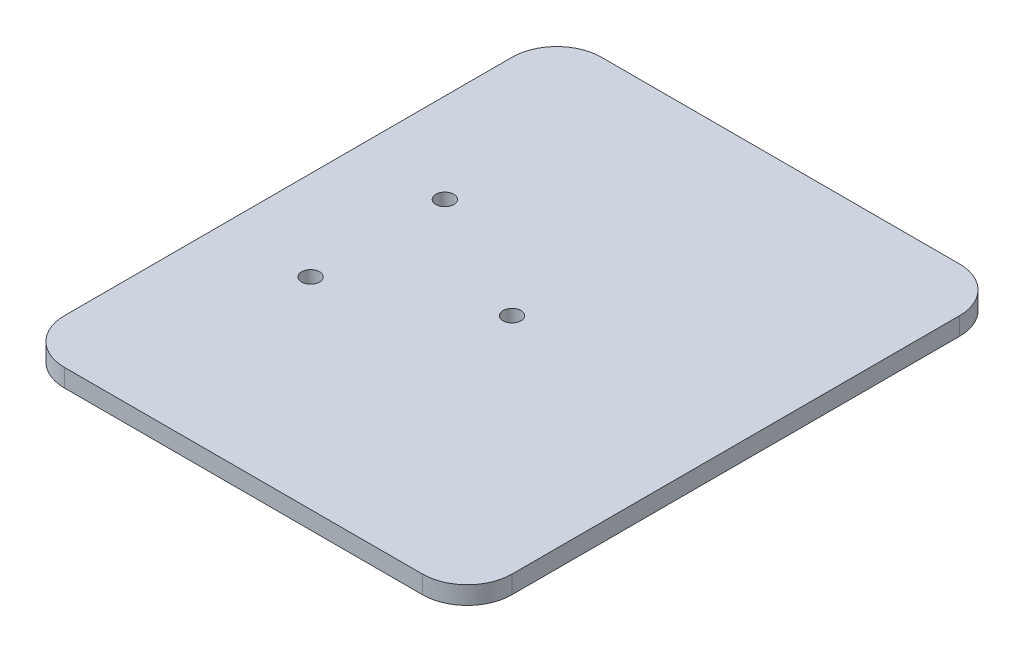
ISO-10303-21;
HEADER;
FILE_DESCRIPTION(('STEP AP214'),'2;1');
FILE_NAME('part.step','',(''),(''),'','','');
FILE_SCHEMA(('AUTOMOTIVE_DESIGN { 1 0 10303 214 1 1 1 1 }'));
ENDSEC;
DATA;
#1=APPLICATION_CONTEXT('core data for automotive mechanical design processes');
#2=APPLICATION_PROTOCOL_DEFINITION('international standard','automotive_design',2000,#1);
#3=PRODUCT_CONTEXT('',#1,'mechanical');
#4=PRODUCT('Part','Part','',(#3));
#5=PRODUCT_RELATED_PRODUCT_CATEGORY('part','',(#4));
#6=PRODUCT_DEFINITION_FORMATION('','',#4);
#7=PRODUCT_DEFINITION_CONTEXT('part definition',#1,'design');
#8=PRODUCT_DEFINITION('design','',#6,#7);
#9=PRODUCT_DEFINITION_SHAPE('','',#8);
#10=(LENGTH_UNIT() NAMED_UNIT(*) SI_UNIT(.MILLI.,.METRE.));
#11=(NAMED_UNIT(*) PLANE_ANGLE_UNIT() SI_UNIT($,.RADIAN.));
#12=(NAMED_UNIT(*) SI_UNIT($,.STERADIAN.) SOLID_ANGLE_UNIT());
#13=UNCERTAINTY_MEASURE_WITH_UNIT(LENGTH_MEASURE(1.E-05),#10,'distance_accuracy_value','');
#14=(GEOMETRIC_REPRESENTATION_CONTEXT(3) GLOBAL_UNCERTAINTY_ASSIGNED_CONTEXT((#13)) GLOBAL_UNIT_ASSIGNED_CONTEXT((#10,
#11,#12)) REPRESENTATION_CONTEXT('',''));
#15=CARTESIAN_POINT('',(0.,0.,0.));
#16=DIRECTION('',(0.,0.,1.));
#17=DIRECTION('',(1.,0.,0.));
#18=AXIS2_PLACEMENT_3D('',#15,#16,#17);
#19=CARTESIAN_POINT('',(-52.2549019607844,2.,28.7254901960784));
#20=DIRECTION('',(0.,1.,0.));
#21=DIRECTION('',(0.,0.,1.));
#22=AXIS2_PLACEMENT_3D('',#19,#20,#21);
#23=PLANE('',#22);
#24=CARTESIAN_POINT('',(-47.2549019607844,2.,-3.77450980392158));
#25=DIRECTION('',(0.,1.,0.));
#26=DIRECTION('',(0.,0.,1.));
#27=AXIS2_PLACEMENT_3D('',#24,#25,#26);
#28=CIRCLE('',#27,0.999999999999998);
#29=CARTESIAN_POINT('',(-47.2549019607844,2.,-2.77450980392158));
#30=VERTEX_POINT('',#29);
#31=EDGE_CURVE('E217',#30,#30,#28,.T.);
#32=ORIENTED_EDGE('',*,*,#31,.F.);
#33=EDGE_LOOP('',(#32));
#34=FACE_BOUND('',#33,.T.);
#35=CARTESIAN_POINT('',(-52.2549019607844,2.,28.7254901960784));
#36=DIRECTION('',(0.,1.,0.));
#37=DIRECTION('',(0.,0.,1.));
#38=AXIS2_PLACEMENT_3D('',#35,#36,#37);
#39=CIRCLE('',#38,5.);
#40=CARTESIAN_POINT('',(-57.2549019607844,2.,28.7254901960784));
#41=VERTEX_POINT('',#40);
#42=CARTESIAN_POINT('',(-52.2549019607843,2.,33.7254901960784));
#43=VERTEX_POINT('',#42);
#44=EDGE_CURVE('E168',#41,#43,#39,.T.);
#45=ORIENTED_EDGE('',*,*,#44,.T.);
#46=DIRECTION('',(1.,0.,0.));
#47=VECTOR('',#46,1.);
#48=CARTESIAN_POINT('',(-52.2549019607843,2.,33.7254901960784));
#49=LINE('',#48,#47);
#50=CARTESIAN_POINT('',(-12.2549019607844,2.,33.7254901960784));
#51=VERTEX_POINT('',#50);
#52=EDGE_CURVE('E104',#43,#51,#49,.T.);
#53=ORIENTED_EDGE('',*,*,#52,.T.);
#54=CARTESIAN_POINT('',(-12.2549019607843,2.,28.7254901960784));
#55=DIRECTION('',(0.,1.,0.));
#56=DIRECTION('',(0.,0.,1.));
#57=AXIS2_PLACEMENT_3D('',#54,#55,#56);
#58=CIRCLE('',#57,5.);
#59=CARTESIAN_POINT('',(-7.25490196078435,2.,28.7254901960784));
#60=VERTEX_POINT('',#59);
#61=EDGE_CURVE('E189',#51,#60,#58,.T.);
#62=ORIENTED_EDGE('',*,*,#61,.T.);
#63=DIRECTION('',(0.,0.,-1.));
#64=VECTOR('',#63,1.);
#65=CARTESIAN_POINT('',(-7.25490196078435,2.,-21.2745098039215));
#66=LINE('',#65,#64);
#67=CARTESIAN_POINT('',(-7.25490196078435,2.,-21.2745098039215));
#68=VERTEX_POINT('',#67);
#69=EDGE_CURVE('E203',#60,#68,#66,.T.);
#70=ORIENTED_EDGE('',*,*,#69,.T.);
#71=CARTESIAN_POINT('',(-12.2549019607843,2.,-21.2745098039216));
#72=DIRECTION('',(0.,1.,0.));
#73=DIRECTION('',(0.,0.,-1.));
#74=AXIS2_PLACEMENT_3D('',#71,#72,#73);
#75=CIRCLE('',#74,5.);
#76=CARTESIAN_POINT('',(-12.2549019607844,2.,-26.2745098039216));
#77=VERTEX_POINT('',#76);
#78=EDGE_CURVE('E123',#68,#77,#75,.T.);
#79=ORIENTED_EDGE('',*,*,#78,.T.);
#80=DIRECTION('',(-1.,0.,0.));
#81=VECTOR('',#80,1.);
#82=CARTESIAN_POINT('',(-52.2549019607843,2.,-26.2745098039216));
#83=LINE('',#82,#81);
#84=CARTESIAN_POINT('',(-52.2549019607843,2.,-26.2745098039216));
#85=VERTEX_POINT('',#84);
#86=EDGE_CURVE('E117',#77,#85,#83,.T.);
#87=ORIENTED_EDGE('',*,*,#86,.T.);
#88=CARTESIAN_POINT('',(-52.2549019607844,2.,-21.2745098039216));
#89=DIRECTION('',(0.,1.,0.));
#90=DIRECTION('',(0.,0.,1.));
#91=AXIS2_PLACEMENT_3D('',#88,#89,#90);
#92=CIRCLE('',#91,5.);
#93=CARTESIAN_POINT('',(-57.2549019607844,2.,-21.2745098039215));
#94=VERTEX_POINT('',#93);
#95=EDGE_CURVE('E121',#85,#94,#92,.T.);
#96=ORIENTED_EDGE('',*,*,#95,.T.);
#97=DIRECTION('',(0.,0.,1.));
#98=VECTOR('',#97,1.);
#99=CARTESIAN_POINT('',(-57.2549019607844,2.,-21.2745098039215));
#100=LINE('',#99,#98);
#101=EDGE_CURVE('E61',#94,#41,#100,.T.);
#102=ORIENTED_EDGE('',*,*,#101,.T.);
#103=EDGE_LOOP('',(#45,#53,#62,#70,#79,#87,#96,#102));
#104=FACE_BOUND('',#103,.T.);
#105=CARTESIAN_POINT('',(-32.2549019607844,2.,3.72549019607842));
#106=DIRECTION('',(0.,1.,0.));
#107=DIRECTION('',(0.,0.,1.));
#108=AXIS2_PLACEMENT_3D('',#105,#106,#107);
#109=CIRCLE('',#108,0.999999999999998);
#110=CARTESIAN_POINT('',(-32.2549019607844,2.,4.72549019607842));
#111=VERTEX_POINT('',#110);
#112=EDGE_CURVE('E150',#111,#111,#109,.T.);
#113=ORIENTED_EDGE('',*,*,#112,.F.);
#114=EDGE_LOOP('',(#113));
#115=FACE_BOUND('',#114,.T.);
#116=CARTESIAN_POINT('',(-47.2549019607844,2.,11.2254901960784));
#117=DIRECTION('',(0.,1.,0.));
#118=DIRECTION('',(0.,0.,1.));
#119=AXIS2_PLACEMENT_3D('',#116,#117,#118);
#120=CIRCLE('',#119,0.999999999999998);
#121=CARTESIAN_POINT('',(-47.2549019607844,2.,12.2254901960784));
#122=VERTEX_POINT('',#121);
#123=EDGE_CURVE('E225',#122,#122,#120,.T.);
#124=ORIENTED_EDGE('',*,*,#123,.F.);
#125=EDGE_LOOP('',(#124));
#126=FACE_BOUND('',#125,.T.);
#127=ADVANCED_FACE('F43',(#34,#104,#115,#126),#23,.T.);
#128=CARTESIAN_POINT('',(-52.2549019607844,0.,28.7254901960784));
#129=DIRECTION('',(0.,1.,0.));
#130=DIRECTION('',(0.,0.,1.));
#131=AXIS2_PLACEMENT_3D('',#128,#129,#130);
#132=PLANE('',#131);
#133=CARTESIAN_POINT('',(-52.2549019607844,0.,28.7254901960784));
#134=DIRECTION('',(0.,1.,0.));
#135=DIRECTION('',(0.,0.,1.));
#136=AXIS2_PLACEMENT_3D('',#133,#134,#135);
#137=CIRCLE('',#136,5.);
#138=CARTESIAN_POINT('',(-57.2549019607844,0.,28.7254901960784));
#139=VERTEX_POINT('',#138);
#140=CARTESIAN_POINT('',(-52.2549019607843,0.,33.7254901960784));
#141=VERTEX_POINT('',#140);
#142=EDGE_CURVE('E145',#139,#141,#137,.T.);
#143=ORIENTED_EDGE('',*,*,#142,.F.);
#144=DIRECTION('',(0.,0.,1.));
#145=VECTOR('',#144,1.);
#146=CARTESIAN_POINT('',(-57.2549019607844,0.,-21.2745098039215));
#147=LINE('',#146,#145);
#148=CARTESIAN_POINT('',(-57.2549019607844,0.,-21.2745098039215));
#149=VERTEX_POINT('',#148);
#150=EDGE_CURVE('E96',#149,#139,#147,.T.);
#151=ORIENTED_EDGE('',*,*,#150,.F.);
#152=CARTESIAN_POINT('',(-52.2549019607844,0.,-21.2745098039216));
#153=DIRECTION('',(0.,1.,0.));
#154=DIRECTION('',(0.,0.,1.));
#155=AXIS2_PLACEMENT_3D('',#152,#153,#154);
#156=CIRCLE('',#155,5.);
#157=CARTESIAN_POINT('',(-52.2549019607843,0.,-26.2745098039216));
#158=VERTEX_POINT('',#157);
#159=EDGE_CURVE('E90',#158,#149,#156,.T.);
#160=ORIENTED_EDGE('',*,*,#159,.F.);
#161=DIRECTION('',(-1.,0.,0.));
#162=VECTOR('',#161,1.);
#163=CARTESIAN_POINT('',(-52.2549019607843,0.,-26.2745098039216));
#164=LINE('',#163,#162);
#165=CARTESIAN_POINT('',(-12.2549019607844,0.,-26.2745098039216));
#166=VERTEX_POINT('',#165);
#167=EDGE_CURVE('E132',#166,#158,#164,.T.);
#168=ORIENTED_EDGE('',*,*,#167,.F.);
#169=CARTESIAN_POINT('',(-12.2549019607843,0.,-21.2745098039216));
#170=DIRECTION('',(0.,1.,0.));
#171=DIRECTION('',(0.,0.,-1.));
#172=AXIS2_PLACEMENT_3D('',#169,#170,#171);
#173=CIRCLE('',#172,5.);
#174=CARTESIAN_POINT('',(-7.25490196078435,0.,-21.2745098039215));
#175=VERTEX_POINT('',#174);
#176=EDGE_CURVE('E159',#175,#166,#173,.T.);
#177=ORIENTED_EDGE('',*,*,#176,.F.);
#178=DIRECTION('',(0.,0.,-1.));
#179=VECTOR('',#178,1.);
#180=CARTESIAN_POINT('',(-7.25490196078435,0.,-21.2745098039215));
#181=LINE('',#180,#179);
#182=CARTESIAN_POINT('',(-7.25490196078435,0.,28.7254901960784));
#183=VERTEX_POINT('',#182);
#184=EDGE_CURVE('E156',#183,#175,#181,.T.);
#185=ORIENTED_EDGE('',*,*,#184,.F.);
#186=CARTESIAN_POINT('',(-12.2549019607843,0.,28.7254901960784));
#187=DIRECTION('',(0.,1.,0.));
#188=DIRECTION('',(0.,0.,1.));
#189=AXIS2_PLACEMENT_3D('',#186,#187,#188);
#190=CIRCLE('',#189,5.);
#191=CARTESIAN_POINT('',(-12.2549019607844,0.,33.7254901960784));
#192=VERTEX_POINT('',#191);
#193=EDGE_CURVE('E153',#192,#183,#190,.T.);
#194=ORIENTED_EDGE('',*,*,#193,.F.);
#195=DIRECTION('',(1.,0.,0.));
#196=VECTOR('',#195,1.);
#197=CARTESIAN_POINT('',(-52.2549019607843,0.,33.7254901960784));
#198=LINE('',#197,#196);
#199=EDGE_CURVE('E149',#141,#192,#198,.T.);
#200=ORIENTED_EDGE('',*,*,#199,.F.);
#201=EDGE_LOOP('',(#143,#151,#160,#168,#177,#185,#194,#200));
#202=FACE_BOUND('',#201,.T.);
#203=CARTESIAN_POINT('',(-32.2549019607844,0.,3.72549019607842));
#204=DIRECTION('',(0.,1.,0.));
#205=DIRECTION('',(0.,0.,1.));
#206=AXIS2_PLACEMENT_3D('',#203,#204,#205);
#207=CIRCLE('',#206,0.999999999999998);
#208=CARTESIAN_POINT('',(-32.2549019607844,0.,4.72549019607842));
#209=VERTEX_POINT('',#208);
#210=EDGE_CURVE('E213',#209,#209,#207,.T.);
#211=ORIENTED_EDGE('',*,*,#210,.T.);
#212=EDGE_LOOP('',(#211));
#213=FACE_BOUND('',#212,.T.);
#214=CARTESIAN_POINT('',(-47.2549019607844,0.,-3.77450980392158));
#215=DIRECTION('',(0.,1.,0.));
#216=DIRECTION('',(0.,0.,1.));
#217=AXIS2_PLACEMENT_3D('',#214,#215,#216);
#218=CIRCLE('',#217,0.999999999999998);
#219=CARTESIAN_POINT('',(-47.2549019607844,0.,-2.77450980392158));
#220=VERTEX_POINT('',#219);
#221=EDGE_CURVE('E221',#220,#220,#218,.T.);
#222=ORIENTED_EDGE('',*,*,#221,.T.);
#223=EDGE_LOOP('',(#222));
#224=FACE_BOUND('',#223,.T.);
#225=CARTESIAN_POINT('',(-47.2549019607844,0.,11.2254901960784));
#226=DIRECTION('',(0.,1.,0.));
#227=DIRECTION('',(0.,0.,1.));
#228=AXIS2_PLACEMENT_3D('',#225,#226,#227);
#229=CIRCLE('',#228,0.999999999999998);
#230=CARTESIAN_POINT('',(-47.2549019607844,0.,12.2254901960784));
#231=VERTEX_POINT('',#230);
#232=EDGE_CURVE('E229',#231,#231,#229,.T.);
#233=ORIENTED_EDGE('',*,*,#232,.T.);
#234=EDGE_LOOP('',(#233));
#235=FACE_BOUND('',#234,.T.);
#236=ADVANCED_FACE('F193',(#202,#213,#224,#235),#132,.F.);
#237=CARTESIAN_POINT('',(-52.2549019607844,2.,28.7254901960784));
#238=DIRECTION('',(0.,-1.,0.));
#239=DIRECTION('',(0.,0.,-1.));
#240=AXIS2_PLACEMENT_3D('',#237,#238,#239);
#241=CYLINDRICAL_SURFACE('',#240,5.);
#242=ORIENTED_EDGE('',*,*,#142,.T.);
#243=DIRECTION('',(0.,-1.,0.));
#244=VECTOR('',#243,1.);
#245=CARTESIAN_POINT('',(-52.2549019607843,2.,33.7254901960784));
#246=LINE('',#245,#244);
#247=EDGE_CURVE('E11',#43,#141,#246,.T.);
#248=ORIENTED_EDGE('',*,*,#247,.F.);
#249=ORIENTED_EDGE('',*,*,#44,.F.);
#250=DIRECTION('',(0.,-1.,0.));
#251=VECTOR('',#250,1.);
#252=CARTESIAN_POINT('',(-57.2549019607844,2.,28.7254901960784));
#253=LINE('',#252,#251);
#254=EDGE_CURVE('E141',#41,#139,#253,.T.);
#255=ORIENTED_EDGE('',*,*,#254,.T.);
#256=EDGE_LOOP('',(#242,#248,#249,#255));
#257=FACE_BOUND('',#256,.T.);
#258=ADVANCED_FACE('F45',(#257),#241,.T.);
#259=CARTESIAN_POINT('',(-52.2549019607843,2.,33.7254901960784));
#260=DIRECTION('',(0.,0.,-1.));
#261=DIRECTION('',(-1.,0.,0.));
#262=AXIS2_PLACEMENT_3D('',#259,#260,#261);
#263=PLANE('',#262);
#264=ORIENTED_EDGE('',*,*,#199,.T.);
#265=DIRECTION('',(0.,-1.,0.));
#266=VECTOR('',#265,1.);
#267=CARTESIAN_POINT('',(-12.2549019607844,2.,33.7254901960784));
#268=LINE('',#267,#266);
#269=EDGE_CURVE('E53',#51,#192,#268,.T.);
#270=ORIENTED_EDGE('',*,*,#269,.F.);
#271=ORIENTED_EDGE('',*,*,#52,.F.);
#272=ORIENTED_EDGE('',*,*,#247,.T.);
#273=EDGE_LOOP('',(#264,#270,#271,#272));
#274=FACE_BOUND('',#273,.T.);
#275=ADVANCED_FACE('F264',(#274),#263,.F.);
#276=CARTESIAN_POINT('',(-12.2549019607843,2.,28.7254901960784));
#277=DIRECTION('',(0.,-1.,0.));
#278=DIRECTION('',(0.,0.,-1.));
#279=AXIS2_PLACEMENT_3D('',#276,#277,#278);
#280=CYLINDRICAL_SURFACE('',#279,5.);
#281=ORIENTED_EDGE('',*,*,#193,.T.);
#282=DIRECTION('',(0.,-1.,0.));
#283=VECTOR('',#282,1.);
#284=CARTESIAN_POINT('',(-7.25490196078435,2.,28.7254901960784));
#285=LINE('',#284,#283);
#286=EDGE_CURVE('E179',#60,#183,#285,.T.);
#287=ORIENTED_EDGE('',*,*,#286,.F.);
#288=ORIENTED_EDGE('',*,*,#61,.F.);
#289=ORIENTED_EDGE('',*,*,#269,.T.);
#290=EDGE_LOOP('',(#281,#287,#288,#289));
#291=FACE_BOUND('',#290,.T.);
#292=ADVANCED_FACE('F187',(#291),#280,.T.);
#293=CARTESIAN_POINT('',(-7.25490196078435,2.,-21.2745098039215));
#294=DIRECTION('',(-1.,0.,0.));
#295=DIRECTION('',(0.,0.,1.));
#296=AXIS2_PLACEMENT_3D('',#293,#294,#295);
#297=PLANE('',#296);
#298=ORIENTED_EDGE('',*,*,#184,.T.);
#299=DIRECTION('',(0.,-1.,0.));
#300=VECTOR('',#299,1.);
#301=CARTESIAN_POINT('',(-7.25490196078435,2.,-21.2745098039215));
#302=LINE('',#301,#300);
#303=EDGE_CURVE('E175',#68,#175,#302,.T.);
#304=ORIENTED_EDGE('',*,*,#303,.F.);
#305=ORIENTED_EDGE('',*,*,#69,.F.);
#306=ORIENTED_EDGE('',*,*,#286,.T.);
#307=EDGE_LOOP('',(#298,#304,#305,#306));
#308=FACE_BOUND('',#307,.T.);
#309=ADVANCED_FACE('F198',(#308),#297,.F.);
#310=CARTESIAN_POINT('',(-12.2549019607843,2.,-21.2745098039216));
#311=DIRECTION('',(0.,-1.,0.));
#312=DIRECTION('',(0.,0.,-1.));
#313=AXIS2_PLACEMENT_3D('',#310,#311,#312);
#314=CYLINDRICAL_SURFACE('',#313,5.);
#315=ORIENTED_EDGE('',*,*,#176,.T.);
#316=DIRECTION('',(0.,-1.,0.));
#317=VECTOR('',#316,1.);
#318=CARTESIAN_POINT('',(-12.2549019607844,2.,-26.2745098039216));
#319=LINE('',#318,#317);
#320=EDGE_CURVE('E134',#77,#166,#319,.T.);
#321=ORIENTED_EDGE('',*,*,#320,.F.);
#322=ORIENTED_EDGE('',*,*,#78,.F.);
#323=ORIENTED_EDGE('',*,*,#303,.T.);
#324=EDGE_LOOP('',(#315,#321,#322,#323));
#325=FACE_BOUND('',#324,.T.);
#326=ADVANCED_FACE('F201',(#325),#314,.T.);
#327=CARTESIAN_POINT('',(-52.2549019607843,2.,-26.2745098039216));
#328=DIRECTION('',(0.,0.,1.));
#329=DIRECTION('',(1.,0.,0.));
#330=AXIS2_PLACEMENT_3D('',#327,#328,#329);
#331=PLANE('',#330);
#332=ORIENTED_EDGE('',*,*,#167,.T.);
#333=DIRECTION('',(0.,-1.,0.));
#334=VECTOR('',#333,1.);
#335=CARTESIAN_POINT('',(-52.2549019607843,2.,-26.2745098039216));
#336=LINE('',#335,#334);
#337=EDGE_CURVE('E129',#85,#158,#336,.T.);
#338=ORIENTED_EDGE('',*,*,#337,.F.);
#339=ORIENTED_EDGE('',*,*,#86,.F.);
#340=ORIENTED_EDGE('',*,*,#320,.T.);
#341=EDGE_LOOP('',(#332,#338,#339,#340));
#342=FACE_BOUND('',#341,.T.);
#343=ADVANCED_FACE('F130',(#342),#331,.F.);
#344=CARTESIAN_POINT('',(-52.2549019607844,2.,-21.2745098039216));
#345=DIRECTION('',(0.,-1.,0.));
#346=DIRECTION('',(0.,0.,-1.));
#347=AXIS2_PLACEMENT_3D('',#344,#345,#346);
#348=CYLINDRICAL_SURFACE('',#347,5.);
#349=ORIENTED_EDGE('',*,*,#159,.T.);
#350=DIRECTION('',(0.,-1.,0.));
#351=VECTOR('',#350,1.);
#352=CARTESIAN_POINT('',(-57.2549019607844,2.,-21.2745098039215));
#353=LINE('',#352,#351);
#354=EDGE_CURVE('E135',#94,#149,#353,.T.);
#355=ORIENTED_EDGE('',*,*,#354,.F.);
#356=ORIENTED_EDGE('',*,*,#95,.F.);
#357=ORIENTED_EDGE('',*,*,#337,.T.);
#358=EDGE_LOOP('',(#349,#355,#356,#357));
#359=FACE_BOUND('',#358,.T.);
#360=ADVANCED_FACE('F137',(#359),#348,.T.);
#361=CARTESIAN_POINT('',(-57.2549019607844,2.,-21.2745098039215));
#362=DIRECTION('',(1.,0.,0.));
#363=DIRECTION('',(0.,0.,-1.));
#364=AXIS2_PLACEMENT_3D('',#361,#362,#363);
#365=PLANE('',#364);
#366=ORIENTED_EDGE('',*,*,#150,.T.);
#367=ORIENTED_EDGE('',*,*,#254,.F.);
#368=ORIENTED_EDGE('',*,*,#101,.F.);
#369=ORIENTED_EDGE('',*,*,#354,.T.);
#370=EDGE_LOOP('',(#366,#367,#368,#369));
#371=FACE_BOUND('',#370,.T.);
#372=ADVANCED_FACE('F252',(#371),#365,.F.);
#373=CARTESIAN_POINT('',(-32.2549019607844,2.,3.72549019607842));
#374=DIRECTION('',(0.,-1.,0.));
#375=DIRECTION('',(0.,0.,-1.));
#376=AXIS2_PLACEMENT_3D('',#373,#374,#375);
#377=CYLINDRICAL_SURFACE('',#376,0.999999999999998);
#378=ORIENTED_EDGE('',*,*,#112,.T.);
#379=EDGE_LOOP('',(#378));
#380=FACE_BOUND('',#379,.T.);
#381=ORIENTED_EDGE('',*,*,#210,.F.);
#382=EDGE_LOOP('',(#381));
#383=FACE_BOUND('',#382,.T.);
#384=ADVANCED_FACE('F249',(#380,#383),#377,.F.);
#385=CARTESIAN_POINT('',(-47.2549019607844,2.,-3.77450980392158));
#386=DIRECTION('',(0.,-1.,0.));
#387=DIRECTION('',(0.,0.,-1.));
#388=AXIS2_PLACEMENT_3D('',#385,#386,#387);
#389=CYLINDRICAL_SURFACE('',#388,0.999999999999998);
#390=ORIENTED_EDGE('',*,*,#31,.T.);
#391=EDGE_LOOP('',(#390));
#392=FACE_BOUND('',#391,.T.);
#393=ORIENTED_EDGE('',*,*,#221,.F.);
#394=EDGE_LOOP('',(#393));
#395=FACE_BOUND('',#394,.T.);
#396=ADVANCED_FACE('F340',(#392,#395),#389,.F.);
#397=CARTESIAN_POINT('',(-47.2549019607844,2.,11.2254901960784));
#398=DIRECTION('',(0.,-1.,0.));
#399=DIRECTION('',(0.,0.,-1.));
#400=AXIS2_PLACEMENT_3D('',#397,#398,#399);
#401=CYLINDRICAL_SURFACE('',#400,0.999999999999998);
#402=ORIENTED_EDGE('',*,*,#123,.T.);
#403=EDGE_LOOP('',(#402));
#404=FACE_BOUND('',#403,.T.);
#405=ORIENTED_EDGE('',*,*,#232,.F.);
#406=EDGE_LOOP('',(#405));
#407=FACE_BOUND('',#406,.T.);
#408=ADVANCED_FACE('F237',(#404,#407),#401,.F.);
#409=CLOSED_SHELL('',(#127,#236,#258,#275,#292,#309,#326,#343,#360,#372,#384,#396,#408));
#410=MANIFOLD_SOLID_BREP('B2',#409);
#411=ADVANCED_BREP_SHAPE_REPRESENTATION('',(#18,#410),#14);
#412=SHAPE_DEFINITION_REPRESENTATION(#9,#411);
ENDSEC;
END-ISO-10303-21;
